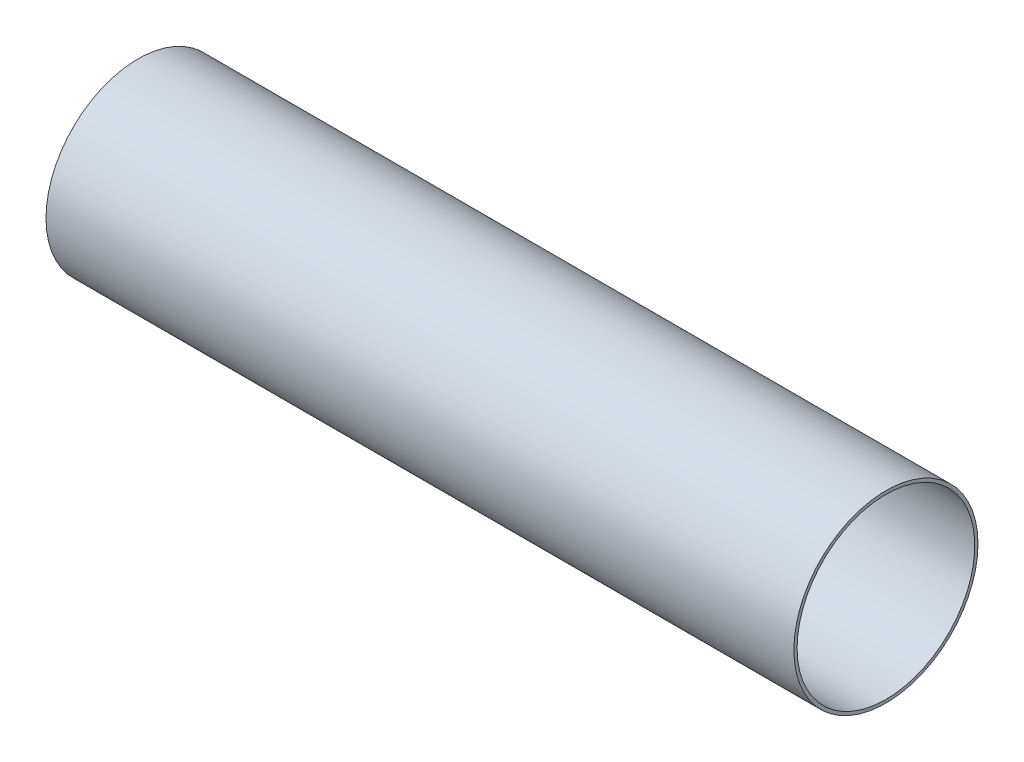
ISO-10303-21;
HEADER;
FILE_DESCRIPTION(('STEP AP214'),'2;1');
FILE_NAME('part.step','',(''),(''),'','','');
FILE_SCHEMA(('AUTOMOTIVE_DESIGN { 1 0 10303 214 1 1 1 1 }'));
ENDSEC;
DATA;
#1=APPLICATION_CONTEXT('core data for automotive mechanical design processes');
#2=APPLICATION_PROTOCOL_DEFINITION('international standard','automotive_design',2000,#1);
#3=PRODUCT_CONTEXT('',#1,'mechanical');
#4=PRODUCT('Part','Part','',(#3));
#5=PRODUCT_RELATED_PRODUCT_CATEGORY('part','',(#4));
#6=PRODUCT_DEFINITION_FORMATION('','',#4);
#7=PRODUCT_DEFINITION_CONTEXT('part definition',#1,'design');
#8=PRODUCT_DEFINITION('design','',#6,#7);
#9=PRODUCT_DEFINITION_SHAPE('','',#8);
#10=(LENGTH_UNIT() NAMED_UNIT(*) SI_UNIT(.MILLI.,.METRE.));
#11=(NAMED_UNIT(*) PLANE_ANGLE_UNIT() SI_UNIT($,.RADIAN.));
#12=(NAMED_UNIT(*) SI_UNIT($,.STERADIAN.) SOLID_ANGLE_UNIT());
#13=UNCERTAINTY_MEASURE_WITH_UNIT(LENGTH_MEASURE(1.E-05),#10,'distance_accuracy_value','');
#14=(GEOMETRIC_REPRESENTATION_CONTEXT(3) GLOBAL_UNCERTAINTY_ASSIGNED_CONTEXT((#13)) GLOBAL_UNIT_ASSIGNED_CONTEXT((#10,
#11,#12)) REPRESENTATION_CONTEXT('',''));
#15=CARTESIAN_POINT('',(0.,0.,0.));
#16=DIRECTION('',(0.,0.,1.));
#17=DIRECTION('',(1.,0.,0.));
#18=AXIS2_PLACEMENT_3D('',#15,#16,#17);
#19=CARTESIAN_POINT('',(0.,57.,0.));
#20=DIRECTION('',(1.,0.,0.));
#21=DIRECTION('',(0.,0.,-1.));
#22=AXIS2_PLACEMENT_3D('',#19,#20,#21);
#23=PLANE('',#22);
#24=CARTESIAN_POINT('',(0.,0.,0.));
#25=DIRECTION('',(-1.,0.,0.));
#26=DIRECTION('',(0.,0.,1.));
#27=AXIS2_PLACEMENT_3D('',#24,#25,#26);
#28=CIRCLE('',#27,55.);
#29=CARTESIAN_POINT('',(0.,0.,55.));
#30=VERTEX_POINT('',#29);
#31=EDGE_CURVE('E10',#30,#30,#28,.T.);
#32=ORIENTED_EDGE('',*,*,#31,.F.);
#33=EDGE_LOOP('',(#32));
#34=FACE_BOUND('',#33,.T.);
#35=CARTESIAN_POINT('',(0.,0.,0.));
#36=DIRECTION('',(-1.,0.,0.));
#37=DIRECTION('',(0.,0.,1.));
#38=AXIS2_PLACEMENT_3D('',#35,#36,#37);
#39=CIRCLE('',#38,57.);
#40=CARTESIAN_POINT('',(0.,0.,57.));
#41=VERTEX_POINT('',#40);
#42=EDGE_CURVE('E54',#41,#41,#39,.T.);
#43=ORIENTED_EDGE('',*,*,#42,.T.);
#44=EDGE_LOOP('',(#43));
#45=FACE_BOUND('',#44,.T.);
#46=ADVANCED_FACE('F37',(#34,#45),#23,.F.);
#47=CARTESIAN_POINT('',(0.,0.,0.));
#48=DIRECTION('',(-1.,0.,0.));
#49=DIRECTION('',(0.,0.,1.));
#50=AXIS2_PLACEMENT_3D('',#47,#48,#49);
#51=CYLINDRICAL_SURFACE('',#50,55.);
#52=CARTESIAN_POINT('',(463.,0.,0.));
#53=DIRECTION('',(-1.,0.,0.));
#54=DIRECTION('',(0.,0.,1.));
#55=AXIS2_PLACEMENT_3D('',#52,#53,#54);
#56=CIRCLE('',#55,55.);
#57=CARTESIAN_POINT('',(463.,0.,55.));
#58=VERTEX_POINT('',#57);
#59=EDGE_CURVE('E44',#58,#58,#56,.T.);
#60=ORIENTED_EDGE('',*,*,#59,.F.);
#61=EDGE_LOOP('',(#60));
#62=FACE_BOUND('',#61,.T.);
#63=ORIENTED_EDGE('',*,*,#31,.T.);
#64=EDGE_LOOP('',(#63));
#65=FACE_BOUND('',#64,.T.);
#66=ADVANCED_FACE('F70',(#62,#65),#51,.F.);
#67=CARTESIAN_POINT('',(463.,57.,0.));
#68=DIRECTION('',(-1.,0.,0.));
#69=DIRECTION('',(0.,0.,1.));
#70=AXIS2_PLACEMENT_3D('',#67,#68,#69);
#71=PLANE('',#70);
#72=CARTESIAN_POINT('',(463.,0.,0.));
#73=DIRECTION('',(-1.,0.,0.));
#74=DIRECTION('',(0.,0.,1.));
#75=AXIS2_PLACEMENT_3D('',#72,#73,#74);
#76=CIRCLE('',#75,57.);
#77=CARTESIAN_POINT('',(463.,0.,57.));
#78=VERTEX_POINT('',#77);
#79=EDGE_CURVE('E49',#78,#78,#76,.T.);
#80=ORIENTED_EDGE('',*,*,#79,.F.);
#81=EDGE_LOOP('',(#80));
#82=FACE_BOUND('',#81,.T.);
#83=ORIENTED_EDGE('',*,*,#59,.T.);
#84=EDGE_LOOP('',(#83));
#85=FACE_BOUND('',#84,.T.);
#86=ADVANCED_FACE('F65',(#82,#85),#71,.F.);
#87=CARTESIAN_POINT('',(0.,0.,0.));
#88=DIRECTION('',(-1.,0.,0.));
#89=DIRECTION('',(0.,0.,1.));
#90=AXIS2_PLACEMENT_3D('',#87,#88,#89);
#91=CYLINDRICAL_SURFACE('',#90,57.);
#92=ORIENTED_EDGE('',*,*,#42,.F.);
#93=EDGE_LOOP('',(#92));
#94=FACE_BOUND('',#93,.T.);
#95=ORIENTED_EDGE('',*,*,#79,.T.);
#96=EDGE_LOOP('',(#95));
#97=FACE_BOUND('',#96,.T.);
#98=ADVANCED_FACE('F62',(#94,#97),#91,.T.);
#99=CLOSED_SHELL('',(#46,#66,#86,#98));
#100=MANIFOLD_SOLID_BREP('B2',#99);
#101=ADVANCED_BREP_SHAPE_REPRESENTATION('',(#18,#100),#14);
#102=SHAPE_DEFINITION_REPRESENTATION(#9,#101);
ENDSEC;
END-ISO-10303-21;
